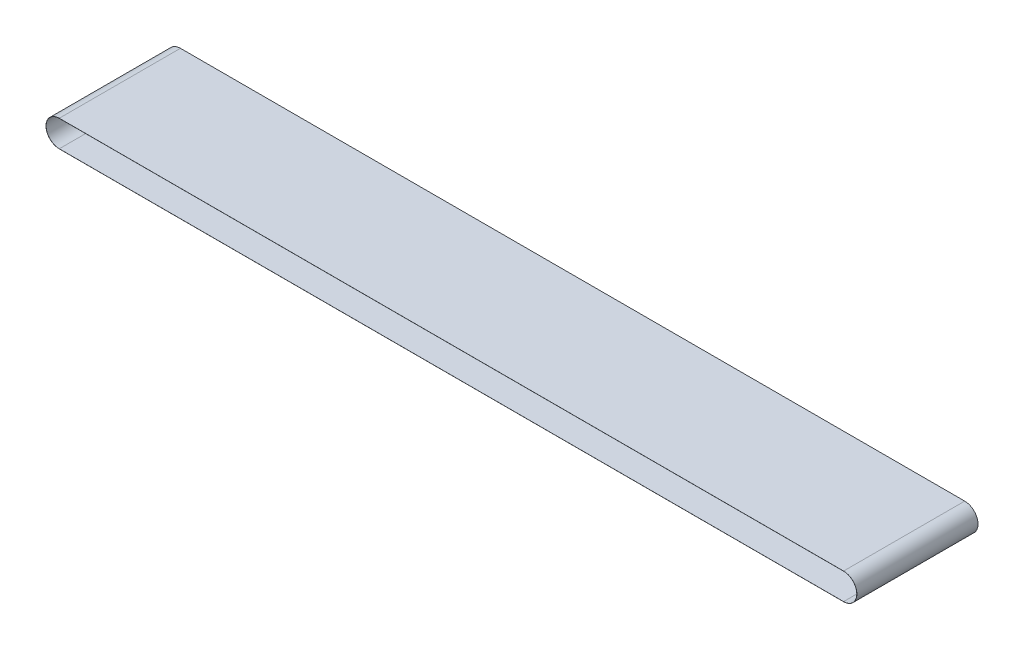
ISO-10303-21;
HEADER;
FILE_DESCRIPTION(('STEP AP214'),'2;1');
FILE_NAME('part.step','',(''),(''),'','','');
FILE_SCHEMA(('AUTOMOTIVE_DESIGN { 1 0 10303 214 1 1 1 1 }'));
ENDSEC;
DATA;
#1=APPLICATION_CONTEXT('core data for automotive mechanical design processes');
#2=APPLICATION_PROTOCOL_DEFINITION('international standard','automotive_design',2000,#1);
#3=PRODUCT_CONTEXT('',#1,'mechanical');
#4=PRODUCT('Part','Part','',(#3));
#5=PRODUCT_RELATED_PRODUCT_CATEGORY('part','',(#4));
#6=PRODUCT_DEFINITION_FORMATION('','',#4);
#7=PRODUCT_DEFINITION_CONTEXT('part definition',#1,'design');
#8=PRODUCT_DEFINITION('design','',#6,#7);
#9=PRODUCT_DEFINITION_SHAPE('','',#8);
#10=(LENGTH_UNIT() NAMED_UNIT(*) SI_UNIT(.MILLI.,.METRE.));
#11=(NAMED_UNIT(*) PLANE_ANGLE_UNIT() SI_UNIT($,.RADIAN.));
#12=(NAMED_UNIT(*) SI_UNIT($,.STERADIAN.) SOLID_ANGLE_UNIT());
#13=UNCERTAINTY_MEASURE_WITH_UNIT(LENGTH_MEASURE(1.E-05),#10,'distance_accuracy_value','');
#14=(GEOMETRIC_REPRESENTATION_CONTEXT(3) GLOBAL_UNCERTAINTY_ASSIGNED_CONTEXT((#13)) GLOBAL_UNIT_ASSIGNED_CONTEXT((#10,
#11,#12)) REPRESENTATION_CONTEXT('',''));
#15=CARTESIAN_POINT('',(0.,0.,0.));
#16=DIRECTION('',(0.,0.,1.));
#17=DIRECTION('',(1.,0.,0.));
#18=AXIS2_PLACEMENT_3D('',#15,#16,#17);
#19=CARTESIAN_POINT('',(0.,0.,762.5));
#20=DIRECTION('',(0.,0.,1.));
#21=DIRECTION('',(1.,0.,0.));
#22=AXIS2_PLACEMENT_3D('',#19,#20,#21);
#23=PLANE('',#22);
#24=CARTESIAN_POINT('',(0.,0.,762.5));
#25=DIRECTION('',(0.,0.,1.));
#26=DIRECTION('',(1.,0.,0.));
#27=AXIS2_PLACEMENT_3D('',#24,#25,#26);
#28=CIRCLE('',#27,167.2);
#29=CARTESIAN_POINT('',(0.,167.2,762.5));
#30=VERTEX_POINT('',#29);
#31=CARTESIAN_POINT('',(0.,-167.2,762.5));
#32=VERTEX_POINT('',#31);
#33=EDGE_CURVE('E135',#30,#32,#28,.T.);
#34=ORIENTED_EDGE('',*,*,#33,.T.);
#35=DIRECTION('',(1.,0.,0.));
#36=VECTOR('',#35,1.);
#37=CARTESIAN_POINT('',(0.,-167.2,762.5));
#38=LINE('',#37,#36);
#39=CARTESIAN_POINT('',(9873.28,-167.2,762.5));
#40=VERTEX_POINT('',#39);
#41=EDGE_CURVE('E138',#32,#40,#38,.T.);
#42=ORIENTED_EDGE('',*,*,#41,.T.);
#43=CARTESIAN_POINT('',(9873.28,0.,762.5));
#44=DIRECTION('',(0.,0.,1.));
#45=DIRECTION('',(1.,0.,0.));
#46=AXIS2_PLACEMENT_3D('',#43,#44,#45);
#47=CIRCLE('',#46,167.2);
#48=CARTESIAN_POINT('',(9873.28,167.2,762.5));
#49=VERTEX_POINT('',#48);
#50=EDGE_CURVE('E141',#40,#49,#47,.T.);
#51=ORIENTED_EDGE('',*,*,#50,.T.);
#52=DIRECTION('',(-1.,0.,0.));
#53=VECTOR('',#52,1.);
#54=CARTESIAN_POINT('',(0.,167.2,762.5));
#55=LINE('',#54,#53);
#56=EDGE_CURVE('E143',#49,#30,#55,.T.);
#57=ORIENTED_EDGE('',*,*,#56,.T.);
#58=EDGE_LOOP('',(#34,#42,#51,#57));
#59=FACE_BOUND('',#58,.T.);
#60=DIRECTION('',(1.,0.,0.));
#61=VECTOR('',#60,1.);
#62=CARTESIAN_POINT('',(0.,-166.,762.5));
#63=LINE('',#62,#61);
#64=CARTESIAN_POINT('',(0.,-166.,762.5));
#65=VERTEX_POINT('',#64);
#66=CARTESIAN_POINT('',(9873.28,-166.,762.5));
#67=VERTEX_POINT('',#66);
#68=EDGE_CURVE('E107',#65,#67,#63,.T.);
#69=ORIENTED_EDGE('',*,*,#68,.F.);
#70=CARTESIAN_POINT('',(0.,0.,762.5));
#71=DIRECTION('',(0.,0.,1.));
#72=DIRECTION('',(1.,0.,0.));
#73=AXIS2_PLACEMENT_3D('',#70,#71,#72);
#74=CIRCLE('',#73,166.);
#75=CARTESIAN_POINT('',(0.,166.,762.5));
#76=VERTEX_POINT('',#75);
#77=EDGE_CURVE('E99',#76,#65,#74,.T.);
#78=ORIENTED_EDGE('',*,*,#77,.F.);
#79=DIRECTION('',(-1.,0.,0.));
#80=VECTOR('',#79,1.);
#81=CARTESIAN_POINT('',(0.,166.,762.5));
#82=LINE('',#81,#80);
#83=CARTESIAN_POINT('',(9873.28,166.,762.5));
#84=VERTEX_POINT('',#83);
#85=EDGE_CURVE('E121',#84,#76,#82,.T.);
#86=ORIENTED_EDGE('',*,*,#85,.F.);
#87=CARTESIAN_POINT('',(9873.28,0.,762.5));
#88=DIRECTION('',(0.,0.,1.));
#89=DIRECTION('',(1.,0.,0.));
#90=AXIS2_PLACEMENT_3D('',#87,#88,#89);
#91=CIRCLE('',#90,166.);
#92=EDGE_CURVE('E119',#67,#84,#91,.T.);
#93=ORIENTED_EDGE('',*,*,#92,.F.);
#94=EDGE_LOOP('',(#69,#78,#86,#93));
#95=FACE_BOUND('',#94,.T.);
#96=ADVANCED_FACE('F34',(#59,#95),#23,.T.);
#97=CARTESIAN_POINT('',(0.,0.,-762.5));
#98=DIRECTION('',(0.,0.,1.));
#99=DIRECTION('',(1.,0.,0.));
#100=AXIS2_PLACEMENT_3D('',#97,#98,#99);
#101=PLANE('',#100);
#102=CARTESIAN_POINT('',(0.,0.,-762.5));
#103=DIRECTION('',(0.,0.,1.));
#104=DIRECTION('',(1.,0.,0.));
#105=AXIS2_PLACEMENT_3D('',#102,#103,#104);
#106=CIRCLE('',#105,167.2);
#107=CARTESIAN_POINT('',(0.,167.2,-762.5));
#108=VERTEX_POINT('',#107);
#109=CARTESIAN_POINT('',(0.,-167.2,-762.5));
#110=VERTEX_POINT('',#109);
#111=EDGE_CURVE('E115',#108,#110,#106,.T.);
#112=ORIENTED_EDGE('',*,*,#111,.F.);
#113=DIRECTION('',(-1.,0.,0.));
#114=VECTOR('',#113,1.);
#115=CARTESIAN_POINT('',(0.,167.2,-762.5));
#116=LINE('',#115,#114);
#117=CARTESIAN_POINT('',(9873.28,167.2,-762.5));
#118=VERTEX_POINT('',#117);
#119=EDGE_CURVE('E139',#118,#108,#116,.T.);
#120=ORIENTED_EDGE('',*,*,#119,.F.);
#121=CARTESIAN_POINT('',(9873.28,0.,-762.5));
#122=DIRECTION('',(0.,0.,1.));
#123=DIRECTION('',(1.,0.,0.));
#124=AXIS2_PLACEMENT_3D('',#121,#122,#123);
#125=CIRCLE('',#124,167.2);
#126=CARTESIAN_POINT('',(9873.28,-167.2,-762.5));
#127=VERTEX_POINT('',#126);
#128=EDGE_CURVE('E150',#127,#118,#125,.T.);
#129=ORIENTED_EDGE('',*,*,#128,.F.);
#130=DIRECTION('',(1.,0.,0.));
#131=VECTOR('',#130,1.);
#132=CARTESIAN_POINT('',(0.,-167.2,-762.5));
#133=LINE('',#132,#131);
#134=EDGE_CURVE('E148',#110,#127,#133,.T.);
#135=ORIENTED_EDGE('',*,*,#134,.F.);
#136=EDGE_LOOP('',(#112,#120,#129,#135));
#137=FACE_BOUND('',#136,.T.);
#138=CARTESIAN_POINT('',(0.,0.,-762.5));
#139=DIRECTION('',(0.,0.,1.));
#140=DIRECTION('',(1.,0.,0.));
#141=AXIS2_PLACEMENT_3D('',#138,#139,#140);
#142=CIRCLE('',#141,166.);
#143=CARTESIAN_POINT('',(0.,166.,-762.5));
#144=VERTEX_POINT('',#143);
#145=CARTESIAN_POINT('',(0.,-166.,-762.5));
#146=VERTEX_POINT('',#145);
#147=EDGE_CURVE('E57',#144,#146,#142,.T.);
#148=ORIENTED_EDGE('',*,*,#147,.T.);
#149=DIRECTION('',(1.,0.,0.));
#150=VECTOR('',#149,1.);
#151=CARTESIAN_POINT('',(0.,-166.,-762.5));
#152=LINE('',#151,#150);
#153=CARTESIAN_POINT('',(9873.28,-166.,-762.5));
#154=VERTEX_POINT('',#153);
#155=EDGE_CURVE('E114',#146,#154,#152,.T.);
#156=ORIENTED_EDGE('',*,*,#155,.T.);
#157=CARTESIAN_POINT('',(9873.28,0.,-762.5));
#158=DIRECTION('',(0.,0.,1.));
#159=DIRECTION('',(1.,0.,0.));
#160=AXIS2_PLACEMENT_3D('',#157,#158,#159);
#161=CIRCLE('',#160,166.);
#162=CARTESIAN_POINT('',(9873.28,166.,-762.5));
#163=VERTEX_POINT('',#162);
#164=EDGE_CURVE('E127',#154,#163,#161,.T.);
#165=ORIENTED_EDGE('',*,*,#164,.T.);
#166=DIRECTION('',(-1.,0.,0.));
#167=VECTOR('',#166,1.);
#168=CARTESIAN_POINT('',(0.,166.,-762.5));
#169=LINE('',#168,#167);
#170=EDGE_CURVE('E108',#163,#144,#169,.T.);
#171=ORIENTED_EDGE('',*,*,#170,.T.);
#172=EDGE_LOOP('',(#148,#156,#165,#171));
#173=FACE_BOUND('',#172,.T.);
#174=ADVANCED_FACE('F168',(#137,#173),#101,.F.);
#175=CARTESIAN_POINT('',(0.,0.,762.5));
#176=DIRECTION('',(0.,0.,-1.));
#177=DIRECTION('',(-1.,0.,0.));
#178=AXIS2_PLACEMENT_3D('',#175,#176,#177);
#179=CYLINDRICAL_SURFACE('',#178,167.2);
#180=ORIENTED_EDGE('',*,*,#111,.T.);
#181=DIRECTION('',(0.,0.,-1.));
#182=VECTOR('',#181,1.);
#183=CARTESIAN_POINT('',(0.,-167.2,762.5));
#184=LINE('',#183,#182);
#185=EDGE_CURVE('E11',#32,#110,#184,.T.);
#186=ORIENTED_EDGE('',*,*,#185,.F.);
#187=ORIENTED_EDGE('',*,*,#33,.F.);
#188=DIRECTION('',(0.,0.,-1.));
#189=VECTOR('',#188,1.);
#190=CARTESIAN_POINT('',(0.,167.2,762.5));
#191=LINE('',#190,#189);
#192=EDGE_CURVE('E145',#30,#108,#191,.T.);
#193=ORIENTED_EDGE('',*,*,#192,.T.);
#194=EDGE_LOOP('',(#180,#186,#187,#193));
#195=FACE_BOUND('',#194,.T.);
#196=ADVANCED_FACE('F36',(#195),#179,.T.);
#197=CARTESIAN_POINT('',(0.,-167.2,762.5));
#198=DIRECTION('',(0.,1.,0.));
#199=DIRECTION('',(0.,0.,1.));
#200=AXIS2_PLACEMENT_3D('',#197,#198,#199);
#201=PLANE('',#200);
#202=ORIENTED_EDGE('',*,*,#134,.T.);
#203=DIRECTION('',(0.,0.,-1.));
#204=VECTOR('',#203,1.);
#205=CARTESIAN_POINT('',(9873.28,-167.2,762.5));
#206=LINE('',#205,#204);
#207=EDGE_CURVE('E42',#40,#127,#206,.T.);
#208=ORIENTED_EDGE('',*,*,#207,.F.);
#209=ORIENTED_EDGE('',*,*,#41,.F.);
#210=ORIENTED_EDGE('',*,*,#185,.T.);
#211=EDGE_LOOP('',(#202,#208,#209,#210));
#212=FACE_BOUND('',#211,.T.);
#213=ADVANCED_FACE('F178',(#212),#201,.F.);
#214=CARTESIAN_POINT('',(9873.28,0.,762.5));
#215=DIRECTION('',(0.,0.,-1.));
#216=DIRECTION('',(-1.,0.,0.));
#217=AXIS2_PLACEMENT_3D('',#214,#215,#216);
#218=CYLINDRICAL_SURFACE('',#217,167.2);
#219=ORIENTED_EDGE('',*,*,#128,.T.);
#220=DIRECTION('',(0.,0.,-1.));
#221=VECTOR('',#220,1.);
#222=CARTESIAN_POINT('',(9873.28,167.2,762.5));
#223=LINE('',#222,#221);
#224=EDGE_CURVE('E155',#49,#118,#223,.T.);
#225=ORIENTED_EDGE('',*,*,#224,.F.);
#226=ORIENTED_EDGE('',*,*,#50,.F.);
#227=ORIENTED_EDGE('',*,*,#207,.T.);
#228=EDGE_LOOP('',(#219,#225,#226,#227));
#229=FACE_BOUND('',#228,.T.);
#230=ADVANCED_FACE('F162',(#229),#218,.T.);
#231=CARTESIAN_POINT('',(0.,167.2,762.5));
#232=DIRECTION('',(0.,-1.,0.));
#233=DIRECTION('',(0.,0.,-1.));
#234=AXIS2_PLACEMENT_3D('',#231,#232,#233);
#235=PLANE('',#234);
#236=ORIENTED_EDGE('',*,*,#119,.T.);
#237=ORIENTED_EDGE('',*,*,#192,.F.);
#238=ORIENTED_EDGE('',*,*,#56,.F.);
#239=ORIENTED_EDGE('',*,*,#224,.T.);
#240=EDGE_LOOP('',(#236,#237,#238,#239));
#241=FACE_BOUND('',#240,.T.);
#242=ADVANCED_FACE('F172',(#241),#235,.F.);
#243=CARTESIAN_POINT('',(0.,0.,762.5));
#244=DIRECTION('',(0.,0.,-1.));
#245=DIRECTION('',(-1.,0.,0.));
#246=AXIS2_PLACEMENT_3D('',#243,#244,#245);
#247=CYLINDRICAL_SURFACE('',#246,166.);
#248=ORIENTED_EDGE('',*,*,#147,.F.);
#249=DIRECTION('',(0.,0.,-1.));
#250=VECTOR('',#249,1.);
#251=CARTESIAN_POINT('',(0.,166.,762.5));
#252=LINE('',#251,#250);
#253=EDGE_CURVE('E103',#76,#144,#252,.T.);
#254=ORIENTED_EDGE('',*,*,#253,.F.);
#255=ORIENTED_EDGE('',*,*,#77,.T.);
#256=DIRECTION('',(0.,0.,-1.));
#257=VECTOR('',#256,1.);
#258=CARTESIAN_POINT('',(0.,-166.,762.5));
#259=LINE('',#258,#257);
#260=EDGE_CURVE('E102',#65,#146,#259,.T.);
#261=ORIENTED_EDGE('',*,*,#260,.T.);
#262=EDGE_LOOP('',(#248,#254,#255,#261));
#263=FACE_BOUND('',#262,.T.);
#264=ADVANCED_FACE('F101',(#263),#247,.F.);
#265=CARTESIAN_POINT('',(0.,-166.,762.5));
#266=DIRECTION('',(0.,1.,0.));
#267=DIRECTION('',(0.,0.,1.));
#268=AXIS2_PLACEMENT_3D('',#265,#266,#267);
#269=PLANE('',#268);
#270=ORIENTED_EDGE('',*,*,#155,.F.);
#271=ORIENTED_EDGE('',*,*,#260,.F.);
#272=ORIENTED_EDGE('',*,*,#68,.T.);
#273=DIRECTION('',(0.,0.,-1.));
#274=VECTOR('',#273,1.);
#275=CARTESIAN_POINT('',(9873.28,-166.,762.5));
#276=LINE('',#275,#274);
#277=EDGE_CURVE('E116',#67,#154,#276,.T.);
#278=ORIENTED_EDGE('',*,*,#277,.T.);
#279=EDGE_LOOP('',(#270,#271,#272,#278));
#280=FACE_BOUND('',#279,.T.);
#281=ADVANCED_FACE('F111',(#280),#269,.T.);
#282=CARTESIAN_POINT('',(9873.28,0.,762.5));
#283=DIRECTION('',(0.,0.,-1.));
#284=DIRECTION('',(-1.,0.,0.));
#285=AXIS2_PLACEMENT_3D('',#282,#283,#284);
#286=CYLINDRICAL_SURFACE('',#285,166.);
#287=ORIENTED_EDGE('',*,*,#164,.F.);
#288=ORIENTED_EDGE('',*,*,#277,.F.);
#289=ORIENTED_EDGE('',*,*,#92,.T.);
#290=DIRECTION('',(0.,0.,-1.));
#291=VECTOR('',#290,1.);
#292=CARTESIAN_POINT('',(9873.28,166.,762.5));
#293=LINE('',#292,#291);
#294=EDGE_CURVE('E49',#84,#163,#293,.T.);
#295=ORIENTED_EDGE('',*,*,#294,.T.);
#296=EDGE_LOOP('',(#287,#288,#289,#295));
#297=FACE_BOUND('',#296,.T.);
#298=ADVANCED_FACE('F201',(#297),#286,.F.);
#299=CARTESIAN_POINT('',(0.,166.,762.5));
#300=DIRECTION('',(0.,-1.,0.));
#301=DIRECTION('',(0.,0.,-1.));
#302=AXIS2_PLACEMENT_3D('',#299,#300,#301);
#303=PLANE('',#302);
#304=ORIENTED_EDGE('',*,*,#170,.F.);
#305=ORIENTED_EDGE('',*,*,#294,.F.);
#306=ORIENTED_EDGE('',*,*,#85,.T.);
#307=ORIENTED_EDGE('',*,*,#253,.T.);
#308=EDGE_LOOP('',(#304,#305,#306,#307));
#309=FACE_BOUND('',#308,.T.);
#310=ADVANCED_FACE('F205',(#309),#303,.T.);
#311=CLOSED_SHELL('',(#96,#174,#196,#213,#230,#242,#264,#281,#298,#310));
#312=MANIFOLD_SOLID_BREP('B2',#311);
#313=ADVANCED_BREP_SHAPE_REPRESENTATION('',(#18,#312),#14);
#314=SHAPE_DEFINITION_REPRESENTATION(#9,#313);
ENDSEC;
END-ISO-10303-21;
